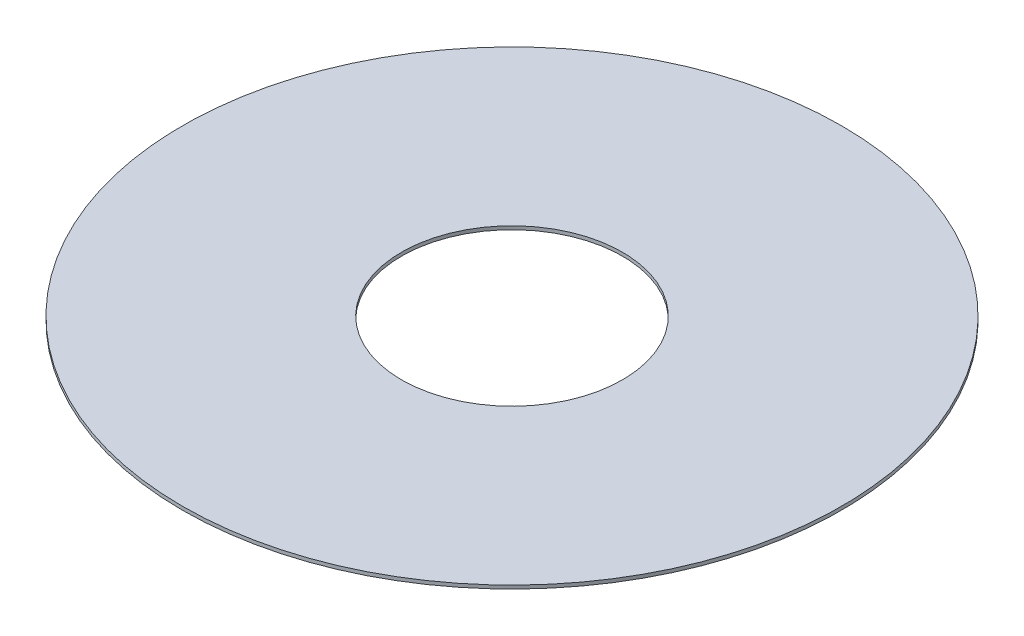
ISO-10303-21;
HEADER;
FILE_DESCRIPTION(('STEP AP214'),'2;1');
FILE_NAME('part.step','',(''),(''),'','','');
FILE_SCHEMA(('AUTOMOTIVE_DESIGN { 1 0 10303 214 1 1 1 1 }'));
ENDSEC;
DATA;
#1=APPLICATION_CONTEXT('core data for automotive mechanical design processes');
#2=APPLICATION_PROTOCOL_DEFINITION('international standard','automotive_design',2000,#1);
#3=PRODUCT_CONTEXT('',#1,'mechanical');
#4=PRODUCT('Part','Part','',(#3));
#5=PRODUCT_RELATED_PRODUCT_CATEGORY('part','',(#4));
#6=PRODUCT_DEFINITION_FORMATION('','',#4);
#7=PRODUCT_DEFINITION_CONTEXT('part definition',#1,'design');
#8=PRODUCT_DEFINITION('design','',#6,#7);
#9=PRODUCT_DEFINITION_SHAPE('','',#8);
#10=(LENGTH_UNIT() NAMED_UNIT(*) SI_UNIT(.MILLI.,.METRE.));
#11=(NAMED_UNIT(*) PLANE_ANGLE_UNIT() SI_UNIT($,.RADIAN.));
#12=(NAMED_UNIT(*) SI_UNIT($,.STERADIAN.) SOLID_ANGLE_UNIT());
#13=UNCERTAINTY_MEASURE_WITH_UNIT(LENGTH_MEASURE(1.E-05),#10,'distance_accuracy_value','');
#14=(GEOMETRIC_REPRESENTATION_CONTEXT(3) GLOBAL_UNCERTAINTY_ASSIGNED_CONTEXT((#13)) GLOBAL_UNIT_ASSIGNED_CONTEXT((#10,
#11,#12)) REPRESENTATION_CONTEXT('',''));
#15=CARTESIAN_POINT('',(0.,0.,0.));
#16=DIRECTION('',(0.,0.,1.));
#17=DIRECTION('',(1.,0.,0.));
#18=AXIS2_PLACEMENT_3D('',#15,#16,#17);
#19=CARTESIAN_POINT('',(0.,0.5,0.));
#20=DIRECTION('',(0.,1.,0.));
#21=DIRECTION('',(0.,0.,1.));
#22=AXIS2_PLACEMENT_3D('',#19,#20,#21);
#23=PLANE('',#22);
#24=CARTESIAN_POINT('',(0.,0.5,0.));
#25=DIRECTION('',(0.,1.,0.));
#26=DIRECTION('',(0.,0.,1.));
#27=AXIS2_PLACEMENT_3D('',#24,#25,#26);
#28=CIRCLE('',#27,47.7);
#29=CARTESIAN_POINT('',(0.,0.5,47.7));
#30=VERTEX_POINT('',#29);
#31=EDGE_CURVE('E10',#30,#30,#28,.T.);
#32=ORIENTED_EDGE('',*,*,#31,.T.);
#33=EDGE_LOOP('',(#32));
#34=FACE_BOUND('',#33,.T.);
#35=CARTESIAN_POINT('',(0.,0.5,0.));
#36=DIRECTION('',(0.,1.,0.));
#37=DIRECTION('',(0.,0.,1.));
#38=AXIS2_PLACEMENT_3D('',#35,#36,#37);
#39=CIRCLE('',#38,16.);
#40=CARTESIAN_POINT('',(0.,0.5,16.));
#41=VERTEX_POINT('',#40);
#42=EDGE_CURVE('E41',#41,#41,#39,.T.);
#43=ORIENTED_EDGE('',*,*,#42,.F.);
#44=EDGE_LOOP('',(#43));
#45=FACE_BOUND('',#44,.T.);
#46=ADVANCED_FACE('F30',(#34,#45),#23,.T.);
#47=CARTESIAN_POINT('',(0.,0.,0.));
#48=DIRECTION('',(0.,1.,0.));
#49=DIRECTION('',(0.,0.,1.));
#50=AXIS2_PLACEMENT_3D('',#47,#48,#49);
#51=PLANE('',#50);
#52=CARTESIAN_POINT('',(0.,0.,0.));
#53=DIRECTION('',(0.,1.,0.));
#54=DIRECTION('',(0.,0.,1.));
#55=AXIS2_PLACEMENT_3D('',#52,#53,#54);
#56=CIRCLE('',#55,47.7);
#57=CARTESIAN_POINT('',(0.,0.,47.7));
#58=VERTEX_POINT('',#57);
#59=EDGE_CURVE('E34',#58,#58,#56,.T.);
#60=ORIENTED_EDGE('',*,*,#59,.F.);
#61=EDGE_LOOP('',(#60));
#62=FACE_BOUND('',#61,.T.);
#63=CARTESIAN_POINT('',(0.,0.,0.));
#64=DIRECTION('',(0.,1.,0.));
#65=DIRECTION('',(0.,0.,1.));
#66=AXIS2_PLACEMENT_3D('',#63,#64,#65);
#67=CIRCLE('',#66,16.);
#68=CARTESIAN_POINT('',(0.,0.,16.));
#69=VERTEX_POINT('',#68);
#70=EDGE_CURVE('E43',#69,#69,#67,.T.);
#71=ORIENTED_EDGE('',*,*,#70,.T.);
#72=EDGE_LOOP('',(#71));
#73=FACE_BOUND('',#72,.T.);
#74=ADVANCED_FACE('F53',(#62,#73),#51,.F.);
#75=CARTESIAN_POINT('',(0.,0.5,0.));
#76=DIRECTION('',(0.,-1.,0.));
#77=DIRECTION('',(0.,0.,-1.));
#78=AXIS2_PLACEMENT_3D('',#75,#76,#77);
#79=CYLINDRICAL_SURFACE('',#78,47.7);
#80=ORIENTED_EDGE('',*,*,#31,.F.);
#81=EDGE_LOOP('',(#80));
#82=FACE_BOUND('',#81,.T.);
#83=ORIENTED_EDGE('',*,*,#59,.T.);
#84=EDGE_LOOP('',(#83));
#85=FACE_BOUND('',#84,.T.);
#86=ADVANCED_FACE('F32',(#82,#85),#79,.T.);
#87=CARTESIAN_POINT('',(0.,0.5,0.));
#88=DIRECTION('',(0.,-1.,0.));
#89=DIRECTION('',(0.,0.,-1.));
#90=AXIS2_PLACEMENT_3D('',#87,#88,#89);
#91=CYLINDRICAL_SURFACE('',#90,16.);
#92=ORIENTED_EDGE('',*,*,#42,.T.);
#93=EDGE_LOOP('',(#92));
#94=FACE_BOUND('',#93,.T.);
#95=ORIENTED_EDGE('',*,*,#70,.F.);
#96=EDGE_LOOP('',(#95));
#97=FACE_BOUND('',#96,.T.);
#98=ADVANCED_FACE('F49',(#94,#97),#91,.F.);
#99=CLOSED_SHELL('',(#46,#74,#86,#98));
#100=MANIFOLD_SOLID_BREP('B2',#99);
#101=ADVANCED_BREP_SHAPE_REPRESENTATION('',(#18,#100),#14);
#102=SHAPE_DEFINITION_REPRESENTATION(#9,#101);
ENDSEC;
END-ISO-10303-21;
